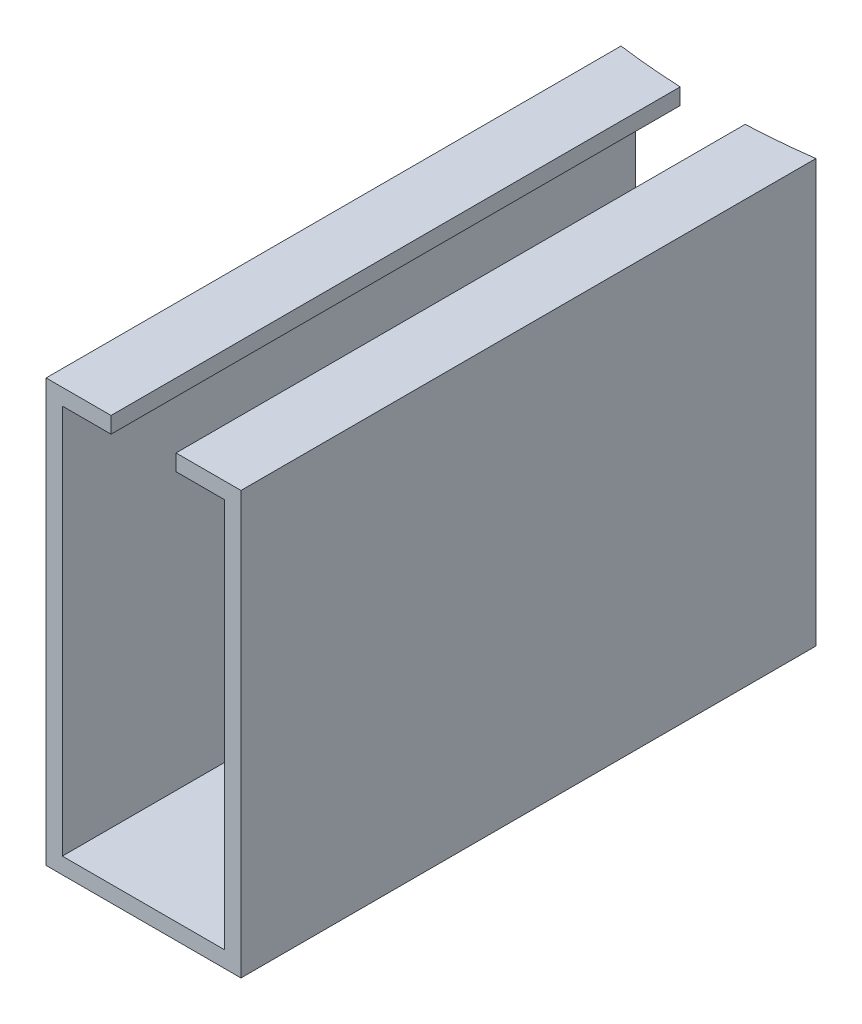
ISO-10303-21;
HEADER;
FILE_DESCRIPTION(('STEP AP214'),'2;1');
FILE_NAME('part.step','',(''),(''),'','','');
FILE_SCHEMA(('AUTOMOTIVE_DESIGN { 1 0 10303 214 1 1 1 1 }'));
ENDSEC;
DATA;
#1=APPLICATION_CONTEXT('core data for automotive mechanical design processes');
#2=APPLICATION_PROTOCOL_DEFINITION('international standard','automotive_design',2000,#1);
#3=PRODUCT_CONTEXT('',#1,'mechanical');
#4=PRODUCT('Part','Part','',(#3));
#5=PRODUCT_RELATED_PRODUCT_CATEGORY('part','',(#4));
#6=PRODUCT_DEFINITION_FORMATION('','',#4);
#7=PRODUCT_DEFINITION_CONTEXT('part definition',#1,'design');
#8=PRODUCT_DEFINITION('design','',#6,#7);
#9=PRODUCT_DEFINITION_SHAPE('','',#8);
#10=(LENGTH_UNIT() NAMED_UNIT(*) SI_UNIT(.MILLI.,.METRE.));
#11=(NAMED_UNIT(*) PLANE_ANGLE_UNIT() SI_UNIT($,.RADIAN.));
#12=(NAMED_UNIT(*) SI_UNIT($,.STERADIAN.) SOLID_ANGLE_UNIT());
#13=UNCERTAINTY_MEASURE_WITH_UNIT(LENGTH_MEASURE(1.E-05),#10,'distance_accuracy_value','');
#14=(GEOMETRIC_REPRESENTATION_CONTEXT(3) GLOBAL_UNCERTAINTY_ASSIGNED_CONTEXT((#13)) GLOBAL_UNIT_ASSIGNED_CONTEXT((#10,
#11,#12)) REPRESENTATION_CONTEXT('',''));
#15=CARTESIAN_POINT('',(0.,0.,0.));
#16=DIRECTION('',(0.,0.,1.));
#17=DIRECTION('',(1.,0.,0.));
#18=AXIS2_PLACEMENT_3D('',#15,#16,#17);
#19=CARTESIAN_POINT('',(0.,0.,40.));
#20=DIRECTION('',(-1.,0.,0.));
#21=DIRECTION('',(0.,0.,1.));
#22=AXIS2_PLACEMENT_3D('',#19,#20,#21);
#23=PLANE('',#22);
#24=DIRECTION('',(0.,0.,-1.));
#25=VECTOR('',#24,1.);
#26=CARTESIAN_POINT('',(0.,0.,40.));
#27=LINE('',#26,#25);
#28=CARTESIAN_POINT('',(0.,0.,40.));
#29=VERTEX_POINT('',#28);
#30=CARTESIAN_POINT('',(0.,0.,22.3606797749979));
#31=VERTEX_POINT('',#30);
#32=EDGE_CURVE('E179',#29,#31,#27,.T.);
#33=ORIENTED_EDGE('',*,*,#32,.T.);
#34=DIRECTION('',(0.,-1.,0.));
#35=VECTOR('',#34,1.);
#36=CARTESIAN_POINT('',(0.,39.5,22.3606797749979));
#37=LINE('',#36,#35);
#38=CARTESIAN_POINT('',(0.,12.,22.3606797749979));
#39=VERTEX_POINT('',#38);
#40=EDGE_CURVE('E55',#31,#39,#37,.F.);
#41=ORIENTED_EDGE('',*,*,#40,.T.);
#42=DIRECTION('',(0.,0.,-1.));
#43=VECTOR('',#42,1.);
#44=CARTESIAN_POINT('',(0.,12.,40.));
#45=LINE('',#44,#43);
#46=CARTESIAN_POINT('',(0.,12.,40.));
#47=VERTEX_POINT('',#46);
#48=EDGE_CURVE('E48',#47,#39,#45,.T.);
#49=ORIENTED_EDGE('',*,*,#48,.F.);
#50=DIRECTION('',(0.,1.,0.));
#51=VECTOR('',#50,1.);
#52=CARTESIAN_POINT('',(0.,0.,40.));
#53=LINE('',#52,#51);
#54=EDGE_CURVE('E178',#29,#47,#53,.T.);
#55=ORIENTED_EDGE('',*,*,#54,.F.);
#56=EDGE_LOOP('',(#33,#41,#49,#55));
#57=FACE_BOUND('',#56,.T.);
#58=ADVANCED_FACE('F41',(#57),#23,.F.);
#59=CARTESIAN_POINT('',(1.5,12.,40.));
#60=DIRECTION('',(0.,1.,0.));
#61=DIRECTION('',(0.,0.,1.));
#62=AXIS2_PLACEMENT_3D('',#59,#60,#61);
#63=PLANE('',#62);
#64=ORIENTED_EDGE('',*,*,#48,.T.);
#65=CARTESIAN_POINT('',(2.5,12.,0.));
#66=DIRECTION('',(0.,1.,0.));
#67=DIRECTION('',(0.,0.,1.));
#68=AXIS2_PLACEMENT_3D('',#65,#66,#67);
#69=CIRCLE('',#68,22.5);
#70=CARTESIAN_POINT('',(1.5,12.,22.477766792989));
#71=VERTEX_POINT('',#70);
#72=EDGE_CURVE('E173',#39,#71,#69,.T.);
#73=ORIENTED_EDGE('',*,*,#72,.T.);
#74=DIRECTION('',(0.,0.,-1.));
#75=VECTOR('',#74,1.);
#76=CARTESIAN_POINT('',(1.5,12.,40.));
#77=LINE('',#76,#75);
#78=CARTESIAN_POINT('',(1.5,12.,40.));
#79=VERTEX_POINT('',#78);
#80=EDGE_CURVE('E165',#79,#71,#77,.T.);
#81=ORIENTED_EDGE('',*,*,#80,.F.);
#82=DIRECTION('',(1.,0.,0.));
#83=VECTOR('',#82,1.);
#84=CARTESIAN_POINT('',(1.5,12.,40.));
#85=LINE('',#84,#83);
#86=EDGE_CURVE('E174',#47,#79,#85,.T.);
#87=ORIENTED_EDGE('',*,*,#86,.F.);
#88=EDGE_LOOP('',(#64,#73,#81,#87));
#89=FACE_BOUND('',#88,.T.);
#90=ADVANCED_FACE('F171',(#89),#63,.F.);
#91=CARTESIAN_POINT('',(1.5,12.5,40.));
#92=DIRECTION('',(-1.,0.,0.));
#93=DIRECTION('',(0.,0.,1.));
#94=AXIS2_PLACEMENT_3D('',#91,#92,#93);
#95=PLANE('',#94);
#96=ORIENTED_EDGE('',*,*,#80,.T.);
#97=DIRECTION('',(0.,-1.,0.));
#98=VECTOR('',#97,1.);
#99=CARTESIAN_POINT('',(1.5,39.5,22.477766792989));
#100=LINE('',#99,#98);
#101=CARTESIAN_POINT('',(1.5,12.5,22.477766792989));
#102=VERTEX_POINT('',#101);
#103=EDGE_CURVE('E181',#71,#102,#100,.F.);
#104=ORIENTED_EDGE('',*,*,#103,.T.);
#105=DIRECTION('',(0.,0.,-1.));
#106=VECTOR('',#105,1.);
#107=CARTESIAN_POINT('',(1.5,12.5,40.));
#108=LINE('',#107,#106);
#109=CARTESIAN_POINT('',(1.5,12.5,40.));
#110=VERTEX_POINT('',#109);
#111=EDGE_CURVE('E162',#110,#102,#108,.T.);
#112=ORIENTED_EDGE('',*,*,#111,.F.);
#113=DIRECTION('',(0.,1.,0.));
#114=VECTOR('',#113,1.);
#115=CARTESIAN_POINT('',(1.5,12.5,40.));
#116=LINE('',#115,#114);
#117=EDGE_CURVE('E194',#79,#110,#116,.T.);
#118=ORIENTED_EDGE('',*,*,#117,.F.);
#119=EDGE_LOOP('',(#96,#104,#112,#118));
#120=FACE_BOUND('',#119,.T.);
#121=ADVANCED_FACE('F260',(#120),#95,.F.);
#122=CARTESIAN_POINT('',(-0.5,12.5,40.));
#123=DIRECTION('',(0.,-1.,0.));
#124=DIRECTION('',(0.,0.,-1.));
#125=AXIS2_PLACEMENT_3D('',#122,#123,#124);
#126=PLANE('',#125);
#127=ORIENTED_EDGE('',*,*,#111,.T.);
#128=CARTESIAN_POINT('',(2.5,12.5,0.));
#129=DIRECTION('',(0.,-1.,0.));
#130=DIRECTION('',(0.,0.,-1.));
#131=AXIS2_PLACEMENT_3D('',#128,#129,#130);
#132=CIRCLE('',#131,22.5);
#133=CARTESIAN_POINT('',(-0.5,12.5,22.2991031209778));
#134=VERTEX_POINT('',#133);
#135=EDGE_CURVE('E187',#102,#134,#132,.T.);
#136=ORIENTED_EDGE('',*,*,#135,.T.);
#137=DIRECTION('',(0.,0.,-1.));
#138=VECTOR('',#137,1.);
#139=CARTESIAN_POINT('',(-0.5,12.5,40.));
#140=LINE('',#139,#138);
#141=CARTESIAN_POINT('',(-0.5,12.5,40.));
#142=VERTEX_POINT('',#141);
#143=EDGE_CURVE('E154',#142,#134,#140,.T.);
#144=ORIENTED_EDGE('',*,*,#143,.F.);
#145=DIRECTION('',(-1.,0.,0.));
#146=VECTOR('',#145,1.);
#147=CARTESIAN_POINT('',(-0.5,12.5,40.));
#148=LINE('',#147,#146);
#149=EDGE_CURVE('E196',#110,#142,#148,.T.);
#150=ORIENTED_EDGE('',*,*,#149,.F.);
#151=EDGE_LOOP('',(#127,#136,#144,#150));
#152=FACE_BOUND('',#151,.T.);
#153=ADVANCED_FACE('F264',(#152),#126,.F.);
#154=CARTESIAN_POINT('',(-0.5,12.,40.));
#155=DIRECTION('',(1.,0.,0.));
#156=DIRECTION('',(0.,1.,0.));
#157=AXIS2_PLACEMENT_3D('',#154,#155,#156);
#158=PLANE('',#157);
#159=ORIENTED_EDGE('',*,*,#143,.T.);
#160=DIRECTION('',(0.,-1.,0.));
#161=VECTOR('',#160,1.);
#162=CARTESIAN_POINT('',(-0.500000000000003,39.5,22.2991031209778));
#163=LINE('',#162,#161);
#164=CARTESIAN_POINT('',(-0.499999999999999,-0.499999999999999,22.2991031209778));
#165=VERTEX_POINT('',#164);
#166=EDGE_CURVE('E190',#134,#165,#163,.T.);
#167=ORIENTED_EDGE('',*,*,#166,.T.);
#168=DIRECTION('',(0.,0.,-1.));
#169=VECTOR('',#168,1.);
#170=CARTESIAN_POINT('',(-0.499999999999999,-0.499999999999999,40.));
#171=LINE('',#170,#169);
#172=CARTESIAN_POINT('',(-0.499999999999999,-0.499999999999999,40.));
#173=VERTEX_POINT('',#172);
#174=EDGE_CURVE('E147',#173,#165,#171,.T.);
#175=ORIENTED_EDGE('',*,*,#174,.F.);
#176=DIRECTION('',(0.,-1.,0.));
#177=VECTOR('',#176,1.);
#178=CARTESIAN_POINT('',(-0.5,12.,40.));
#179=LINE('',#178,#177);
#180=EDGE_CURVE('E198',#142,#173,#179,.T.);
#181=ORIENTED_EDGE('',*,*,#180,.F.);
#182=EDGE_LOOP('',(#159,#167,#175,#181));
#183=FACE_BOUND('',#182,.T.);
#184=ADVANCED_FACE('F270',(#183),#158,.F.);
#185=CARTESIAN_POINT('',(-0.499999999999999,-0.499999999999999,40.));
#186=DIRECTION('',(0.,1.,0.));
#187=DIRECTION('',(0.,0.,1.));
#188=AXIS2_PLACEMENT_3D('',#185,#186,#187);
#189=PLANE('',#188);
#190=ORIENTED_EDGE('',*,*,#174,.T.);
#191=CARTESIAN_POINT('',(2.5,-0.499999999999999,0.));
#192=DIRECTION('',(0.,-1.,0.));
#193=DIRECTION('',(0.,0.,-1.));
#194=AXIS2_PLACEMENT_3D('',#191,#192,#193);
#195=CIRCLE('',#194,22.5);
#196=CARTESIAN_POINT('',(5.5,-0.499999999999999,22.2991031209778));
#197=VERTEX_POINT('',#196);
#198=EDGE_CURVE('E130',#197,#165,#195,.T.);
#199=ORIENTED_EDGE('',*,*,#198,.F.);
#200=DIRECTION('',(0.,0.,-1.));
#201=VECTOR('',#200,1.);
#202=CARTESIAN_POINT('',(5.5,-0.499999999999999,40.));
#203=LINE('',#202,#201);
#204=CARTESIAN_POINT('',(5.5,-0.499999999999999,40.));
#205=VERTEX_POINT('',#204);
#206=EDGE_CURVE('E144',#205,#197,#203,.T.);
#207=ORIENTED_EDGE('',*,*,#206,.F.);
#208=DIRECTION('',(1.,0.,0.));
#209=VECTOR('',#208,1.);
#210=CARTESIAN_POINT('',(-0.499999999999999,-0.499999999999999,40.));
#211=LINE('',#210,#209);
#212=EDGE_CURVE('E200',#173,#205,#211,.T.);
#213=ORIENTED_EDGE('',*,*,#212,.F.);
#214=EDGE_LOOP('',(#190,#199,#207,#213));
#215=FACE_BOUND('',#214,.T.);
#216=ADVANCED_FACE('F142',(#215),#189,.F.);
#217=CARTESIAN_POINT('',(5.5,12.,40.));
#218=DIRECTION('',(-1.,0.,0.));
#219=DIRECTION('',(0.,0.,1.));
#220=AXIS2_PLACEMENT_3D('',#217,#218,#219);
#221=PLANE('',#220);
#222=ORIENTED_EDGE('',*,*,#206,.T.);
#223=DIRECTION('',(0.,-1.,0.));
#224=VECTOR('',#223,1.);
#225=CARTESIAN_POINT('',(5.5,39.5,22.2991031209778));
#226=LINE('',#225,#224);
#227=CARTESIAN_POINT('',(5.5,12.5,22.2991031209778));
#228=VERTEX_POINT('',#227);
#229=EDGE_CURVE('E127',#197,#228,#226,.F.);
#230=ORIENTED_EDGE('',*,*,#229,.T.);
#231=DIRECTION('',(0.,0.,-1.));
#232=VECTOR('',#231,1.);
#233=CARTESIAN_POINT('',(5.5,12.5,40.));
#234=LINE('',#233,#232);
#235=CARTESIAN_POINT('',(5.5,12.5,40.));
#236=VERTEX_POINT('',#235);
#237=EDGE_CURVE('E152',#236,#228,#234,.T.);
#238=ORIENTED_EDGE('',*,*,#237,.F.);
#239=DIRECTION('',(0.,1.,0.));
#240=VECTOR('',#239,1.);
#241=CARTESIAN_POINT('',(5.5,-0.499999999999999,40.));
#242=LINE('',#241,#240);
#243=EDGE_CURVE('E151',#205,#236,#242,.T.);
#244=ORIENTED_EDGE('',*,*,#243,.F.);
#245=EDGE_LOOP('',(#222,#230,#238,#244));
#246=FACE_BOUND('',#245,.T.);
#247=ADVANCED_FACE('F150',(#246),#221,.F.);
#248=CARTESIAN_POINT('',(5.5,12.5,40.));
#249=DIRECTION('',(0.,-1.,0.));
#250=DIRECTION('',(1.,0.,0.));
#251=AXIS2_PLACEMENT_3D('',#248,#249,#250);
#252=PLANE('',#251);
#253=ORIENTED_EDGE('',*,*,#237,.T.);
#254=CARTESIAN_POINT('',(2.5,12.5,0.));
#255=DIRECTION('',(0.,-1.,0.));
#256=DIRECTION('',(1.,0.,0.));
#257=AXIS2_PLACEMENT_3D('',#254,#255,#256);
#258=CIRCLE('',#257,22.5);
#259=CARTESIAN_POINT('',(3.5,12.5,22.477766792989));
#260=VERTEX_POINT('',#259);
#261=EDGE_CURVE('E133',#228,#260,#258,.T.);
#262=ORIENTED_EDGE('',*,*,#261,.T.);
#263=DIRECTION('',(0.,0.,-1.));
#264=VECTOR('',#263,1.);
#265=CARTESIAN_POINT('',(3.5,12.5,40.));
#266=LINE('',#265,#264);
#267=CARTESIAN_POINT('',(3.5,12.5,40.));
#268=VERTEX_POINT('',#267);
#269=EDGE_CURVE('E156',#268,#260,#266,.T.);
#270=ORIENTED_EDGE('',*,*,#269,.F.);
#271=DIRECTION('',(-1.,0.,0.));
#272=VECTOR('',#271,1.);
#273=CARTESIAN_POINT('',(5.5,12.5,40.));
#274=LINE('',#273,#272);
#275=EDGE_CURVE('E203',#236,#268,#274,.T.);
#276=ORIENTED_EDGE('',*,*,#275,.F.);
#277=EDGE_LOOP('',(#253,#262,#270,#276));
#278=FACE_BOUND('',#277,.T.);
#279=ADVANCED_FACE('F231',(#278),#252,.F.);
#280=CARTESIAN_POINT('',(3.5,12.5,40.));
#281=DIRECTION('',(1.,0.,0.));
#282=DIRECTION('',(0.,0.,-1.));
#283=AXIS2_PLACEMENT_3D('',#280,#281,#282);
#284=PLANE('',#283);
#285=ORIENTED_EDGE('',*,*,#269,.T.);
#286=DIRECTION('',(0.,-1.,0.));
#287=VECTOR('',#286,1.);
#288=CARTESIAN_POINT('',(3.5,39.5,22.477766792989));
#289=LINE('',#288,#287);
#290=CARTESIAN_POINT('',(3.5,12.,22.477766792989));
#291=VERTEX_POINT('',#290);
#292=EDGE_CURVE('E228',#260,#291,#289,.T.);
#293=ORIENTED_EDGE('',*,*,#292,.T.);
#294=DIRECTION('',(0.,0.,-1.));
#295=VECTOR('',#294,1.);
#296=CARTESIAN_POINT('',(3.5,12.,40.));
#297=LINE('',#296,#295);
#298=CARTESIAN_POINT('',(3.5,12.,40.));
#299=VERTEX_POINT('',#298);
#300=EDGE_CURVE('E219',#299,#291,#297,.T.);
#301=ORIENTED_EDGE('',*,*,#300,.F.);
#302=DIRECTION('',(0.,-1.,0.));
#303=VECTOR('',#302,1.);
#304=CARTESIAN_POINT('',(3.5,12.5,40.));
#305=LINE('',#304,#303);
#306=EDGE_CURVE('E205',#268,#299,#305,.T.);
#307=ORIENTED_EDGE('',*,*,#306,.F.);
#308=EDGE_LOOP('',(#285,#293,#301,#307));
#309=FACE_BOUND('',#308,.T.);
#310=ADVANCED_FACE('F226',(#309),#284,.F.);
#311=CARTESIAN_POINT('',(3.5,12.,40.));
#312=DIRECTION('',(0.,1.,0.));
#313=DIRECTION('',(0.,0.,1.));
#314=AXIS2_PLACEMENT_3D('',#311,#312,#313);
#315=PLANE('',#314);
#316=ORIENTED_EDGE('',*,*,#300,.T.);
#317=CARTESIAN_POINT('',(2.5,12.,0.));
#318=DIRECTION('',(0.,1.,0.));
#319=DIRECTION('',(0.,0.,1.));
#320=AXIS2_PLACEMENT_3D('',#317,#318,#319);
#321=CIRCLE('',#320,22.5);
#322=CARTESIAN_POINT('',(5.,12.,22.3606797749979));
#323=VERTEX_POINT('',#322);
#324=EDGE_CURVE('E232',#291,#323,#321,.T.);
#325=ORIENTED_EDGE('',*,*,#324,.T.);
#326=DIRECTION('',(0.,0.,-1.));
#327=VECTOR('',#326,1.);
#328=CARTESIAN_POINT('',(5.,12.,40.));
#329=LINE('',#328,#327);
#330=CARTESIAN_POINT('',(5.,12.,40.));
#331=VERTEX_POINT('',#330);
#332=EDGE_CURVE('E216',#331,#323,#329,.T.);
#333=ORIENTED_EDGE('',*,*,#332,.F.);
#334=DIRECTION('',(1.,0.,0.));
#335=VECTOR('',#334,1.);
#336=CARTESIAN_POINT('',(3.5,12.,40.));
#337=LINE('',#336,#335);
#338=EDGE_CURVE('E207',#299,#331,#337,.T.);
#339=ORIENTED_EDGE('',*,*,#338,.F.);
#340=EDGE_LOOP('',(#316,#325,#333,#339));
#341=FACE_BOUND('',#340,.T.);
#342=ADVANCED_FACE('F254',(#341),#315,.F.);
#343=CARTESIAN_POINT('',(5.,12.,40.));
#344=DIRECTION('',(1.,0.,0.));
#345=DIRECTION('',(0.,1.,0.));
#346=AXIS2_PLACEMENT_3D('',#343,#344,#345);
#347=PLANE('',#346);
#348=ORIENTED_EDGE('',*,*,#332,.T.);
#349=DIRECTION('',(0.,-1.,0.));
#350=VECTOR('',#349,1.);
#351=CARTESIAN_POINT('',(5.,39.5,22.3606797749979));
#352=LINE('',#351,#350);
#353=CARTESIAN_POINT('',(5.,0.,22.3606797749979));
#354=VERTEX_POINT('',#353);
#355=EDGE_CURVE('E148',#323,#354,#352,.T.);
#356=ORIENTED_EDGE('',*,*,#355,.T.);
#357=DIRECTION('',(0.,0.,-1.));
#358=VECTOR('',#357,1.);
#359=CARTESIAN_POINT('',(5.,0.,40.));
#360=LINE('',#359,#358);
#361=CARTESIAN_POINT('',(5.,0.,40.));
#362=VERTEX_POINT('',#361);
#363=EDGE_CURVE('E213',#362,#354,#360,.T.);
#364=ORIENTED_EDGE('',*,*,#363,.F.);
#365=DIRECTION('',(0.,-1.,0.));
#366=VECTOR('',#365,1.);
#367=CARTESIAN_POINT('',(5.,12.,40.));
#368=LINE('',#367,#366);
#369=EDGE_CURVE('E209',#331,#362,#368,.T.);
#370=ORIENTED_EDGE('',*,*,#369,.F.);
#371=EDGE_LOOP('',(#348,#356,#364,#370));
#372=FACE_BOUND('',#371,.T.);
#373=ADVANCED_FACE('F240',(#372),#347,.F.);
#374=CARTESIAN_POINT('',(0.,0.,40.));
#375=DIRECTION('',(0.,-1.,0.));
#376=DIRECTION('',(0.,0.,-1.));
#377=AXIS2_PLACEMENT_3D('',#374,#375,#376);
#378=PLANE('',#377);
#379=ORIENTED_EDGE('',*,*,#363,.T.);
#380=CARTESIAN_POINT('',(2.5,0.,0.));
#381=DIRECTION('',(0.,-1.,0.));
#382=DIRECTION('',(0.,0.,-1.));
#383=AXIS2_PLACEMENT_3D('',#380,#381,#382);
#384=CIRCLE('',#383,22.5);
#385=EDGE_CURVE('E11',#354,#31,#384,.T.);
#386=ORIENTED_EDGE('',*,*,#385,.T.);
#387=ORIENTED_EDGE('',*,*,#32,.F.);
#388=DIRECTION('',(-1.,0.,0.));
#389=VECTOR('',#388,1.);
#390=CARTESIAN_POINT('',(0.,0.,40.));
#391=LINE('',#390,#389);
#392=EDGE_CURVE('E62',#362,#29,#391,.T.);
#393=ORIENTED_EDGE('',*,*,#392,.F.);
#394=EDGE_LOOP('',(#379,#386,#387,#393));
#395=FACE_BOUND('',#394,.T.);
#396=ADVANCED_FACE('F244',(#395),#378,.F.);
#397=CARTESIAN_POINT('',(0.,0.,40.));
#398=DIRECTION('',(0.,0.,1.));
#399=DIRECTION('',(1.,0.,0.));
#400=AXIS2_PLACEMENT_3D('',#397,#398,#399);
#401=PLANE('',#400);
#402=ORIENTED_EDGE('',*,*,#54,.T.);
#403=ORIENTED_EDGE('',*,*,#86,.T.);
#404=ORIENTED_EDGE('',*,*,#117,.T.);
#405=ORIENTED_EDGE('',*,*,#149,.T.);
#406=ORIENTED_EDGE('',*,*,#180,.T.);
#407=ORIENTED_EDGE('',*,*,#212,.T.);
#408=ORIENTED_EDGE('',*,*,#243,.T.);
#409=ORIENTED_EDGE('',*,*,#275,.T.);
#410=ORIENTED_EDGE('',*,*,#306,.T.);
#411=ORIENTED_EDGE('',*,*,#338,.T.);
#412=ORIENTED_EDGE('',*,*,#369,.T.);
#413=ORIENTED_EDGE('',*,*,#392,.T.);
#414=EDGE_LOOP('',(#402,#403,#404,#405,#406,#407,#408,#409,#410,#411,#412,#413));
#415=FACE_BOUND('',#414,.T.);
#416=ADVANCED_FACE('F246',(#415),#401,.T.);
#417=CARTESIAN_POINT('',(2.5,39.5,0.));
#418=DIRECTION('',(0.,-1.,0.));
#419=DIRECTION('',(0.,0.,-1.));
#420=AXIS2_PLACEMENT_3D('',#417,#418,#419);
#421=CYLINDRICAL_SURFACE('',#420,22.5);
#422=ORIENTED_EDGE('',*,*,#135,.F.);
#423=ORIENTED_EDGE('',*,*,#103,.F.);
#424=ORIENTED_EDGE('',*,*,#72,.F.);
#425=ORIENTED_EDGE('',*,*,#40,.F.);
#426=ORIENTED_EDGE('',*,*,#385,.F.);
#427=ORIENTED_EDGE('',*,*,#355,.F.);
#428=ORIENTED_EDGE('',*,*,#324,.F.);
#429=ORIENTED_EDGE('',*,*,#292,.F.);
#430=ORIENTED_EDGE('',*,*,#261,.F.);
#431=ORIENTED_EDGE('',*,*,#229,.F.);
#432=ORIENTED_EDGE('',*,*,#198,.T.);
#433=ORIENTED_EDGE('',*,*,#166,.F.);
#434=EDGE_LOOP('',(#422,#423,#424,#425,#426,#427,#428,#429,#430,#431,#432,#433));
#435=FACE_BOUND('',#434,.T.);
#436=ADVANCED_FACE('F129',(#435),#421,.F.);
#437=CLOSED_SHELL('',(#58,#90,#121,#153,#184,#216,#247,#279,#310,#342,#373,#396,#416,#436));
#438=MANIFOLD_SOLID_BREP('B2',#437);
#439=ADVANCED_BREP_SHAPE_REPRESENTATION('',(#18,#438),#14);
#440=SHAPE_DEFINITION_REPRESENTATION(#9,#439);
ENDSEC;
END-ISO-10303-21;
